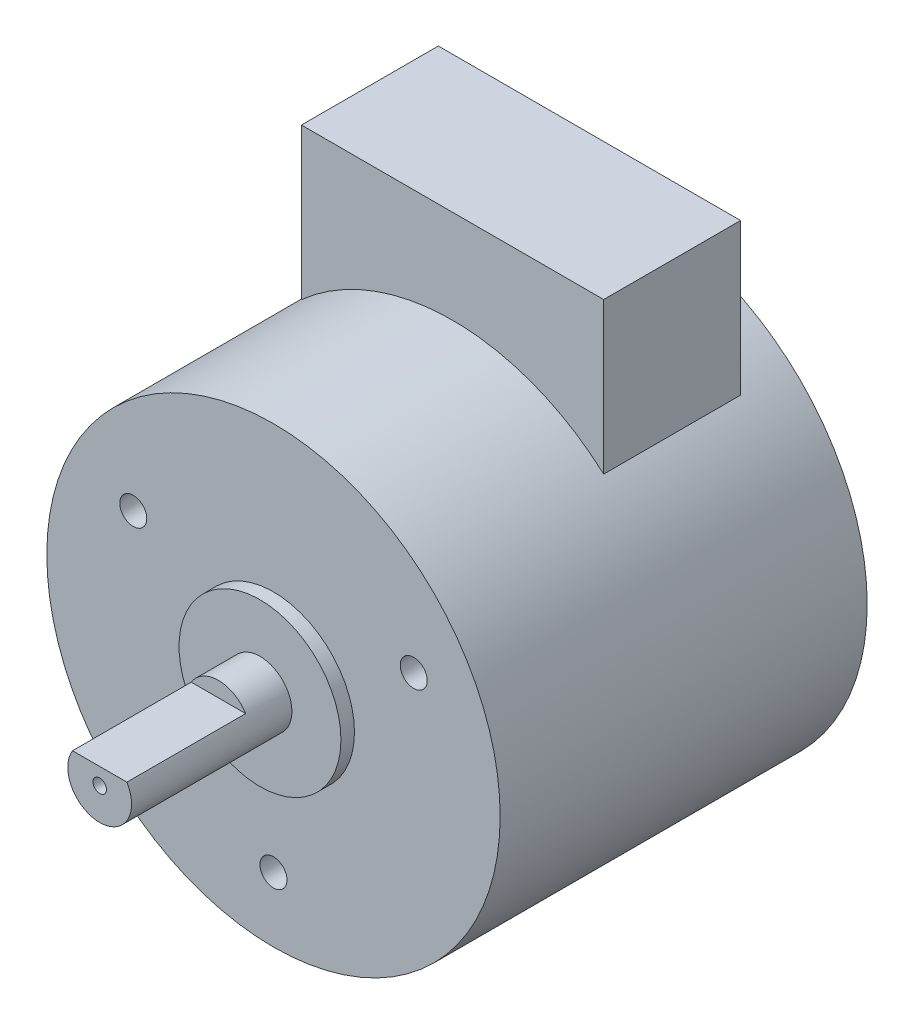
ISO-10303-21;
HEADER;
FILE_DESCRIPTION(('STEP AP214'),'2;1');
FILE_NAME('part.step','',(''),(''),'','','');
FILE_SCHEMA(('AUTOMOTIVE_DESIGN { 1 0 10303 214 1 1 1 1 }'));
ENDSEC;
DATA;
#1=APPLICATION_CONTEXT('core data for automotive mechanical design processes');
#2=APPLICATION_PROTOCOL_DEFINITION('international standard','automotive_design',2000,#1);
#3=PRODUCT_CONTEXT('',#1,'mechanical');
#4=PRODUCT('Part','Part','',(#3));
#5=PRODUCT_RELATED_PRODUCT_CATEGORY('part','',(#4));
#6=PRODUCT_DEFINITION_FORMATION('','',#4);
#7=PRODUCT_DEFINITION_CONTEXT('part definition',#1,'design');
#8=PRODUCT_DEFINITION('design','',#6,#7);
#9=PRODUCT_DEFINITION_SHAPE('','',#8);
#10=(LENGTH_UNIT() NAMED_UNIT(*) SI_UNIT(.MILLI.,.METRE.));
#11=(NAMED_UNIT(*) PLANE_ANGLE_UNIT() SI_UNIT($,.RADIAN.));
#12=(NAMED_UNIT(*) SI_UNIT($,.STERADIAN.) SOLID_ANGLE_UNIT());
#13=UNCERTAINTY_MEASURE_WITH_UNIT(LENGTH_MEASURE(1.E-05),#10,'distance_accuracy_value','');
#14=(GEOMETRIC_REPRESENTATION_CONTEXT(3) GLOBAL_UNCERTAINTY_ASSIGNED_CONTEXT((#13)) GLOBAL_UNIT_ASSIGNED_CONTEXT((#10,
#11,#12)) REPRESENTATION_CONTEXT('',''));
#15=CARTESIAN_POINT('',(0.,0.,0.));
#16=DIRECTION('',(0.,0.,1.));
#17=DIRECTION('',(1.,0.,0.));
#18=AXIS2_PLACEMENT_3D('',#15,#16,#17);
#19=CARTESIAN_POINT('',(0.,0.,34.));
#20=DIRECTION('',(0.,0.,-1.));
#21=DIRECTION('',(-1.,0.,0.));
#22=AXIS2_PLACEMENT_3D('',#19,#20,#21);
#23=CYLINDRICAL_SURFACE('',#22,21.);
#24=DIRECTION('',(0.,0.,1.));
#25=VECTOR('',#24,1.);
#26=CARTESIAN_POINT('',(-14.,15.6524758424985,4.73));
#27=LINE('',#26,#25);
#28=CARTESIAN_POINT('',(-14.,15.6524758424985,4.73));
#29=VERTEX_POINT('',#28);
#30=CARTESIAN_POINT('',(-14.,15.6524758424985,17.41));
#31=VERTEX_POINT('',#30);
#32=EDGE_CURVE('E55',#29,#31,#27,.T.);
#33=ORIENTED_EDGE('',*,*,#32,.F.);
#34=CARTESIAN_POINT('',(0.,0.,4.73));
#35=DIRECTION('',(0.,0.,-1.));
#36=DIRECTION('',(-1.,0.,0.));
#37=AXIS2_PLACEMENT_3D('',#34,#35,#36);
#38=CIRCLE('',#37,21.);
#39=CARTESIAN_POINT('',(14.,15.6524758424985,4.73));
#40=VERTEX_POINT('',#39);
#41=EDGE_CURVE('E59',#29,#40,#38,.T.);
#42=ORIENTED_EDGE('',*,*,#41,.T.);
#43=DIRECTION('',(0.,0.,1.));
#44=VECTOR('',#43,1.);
#45=CARTESIAN_POINT('',(14.,15.6524758424985,4.73));
#46=LINE('',#45,#44);
#47=CARTESIAN_POINT('',(14.,15.6524758424985,17.41));
#48=VERTEX_POINT('',#47);
#49=EDGE_CURVE('E103',#40,#48,#46,.T.);
#50=ORIENTED_EDGE('',*,*,#49,.T.);
#51=CARTESIAN_POINT('',(0.,0.,17.41));
#52=DIRECTION('',(0.,0.,-1.));
#53=DIRECTION('',(-1.,0.,0.));
#54=AXIS2_PLACEMENT_3D('',#51,#52,#53);
#55=CIRCLE('',#54,21.);
#56=EDGE_CURVE('E119',#31,#48,#55,.T.);
#57=ORIENTED_EDGE('',*,*,#56,.F.);
#58=EDGE_LOOP('',(#33,#42,#50,#57));
#59=FACE_BOUND('',#58,.T.);
#60=CARTESIAN_POINT('',(0.,0.,34.));
#61=DIRECTION('',(0.,0.,1.));
#62=DIRECTION('',(1.,0.,0.));
#63=AXIS2_PLACEMENT_3D('',#60,#61,#62);
#64=CIRCLE('',#63,21.);
#65=CARTESIAN_POINT('',(21.,0.,34.));
#66=VERTEX_POINT('',#65);
#67=EDGE_CURVE('E174',#66,#66,#64,.T.);
#68=ORIENTED_EDGE('',*,*,#67,.F.);
#69=EDGE_LOOP('',(#68));
#70=FACE_BOUND('',#69,.T.);
#71=CARTESIAN_POINT('',(0.,0.,0.));
#72=DIRECTION('',(0.,0.,1.));
#73=DIRECTION('',(1.,0.,0.));
#74=AXIS2_PLACEMENT_3D('',#71,#72,#73);
#75=CIRCLE('',#74,21.);
#76=CARTESIAN_POINT('',(21.,0.,0.));
#77=VERTEX_POINT('',#76);
#78=EDGE_CURVE('E42',#77,#77,#75,.T.);
#79=ORIENTED_EDGE('',*,*,#78,.T.);
#80=EDGE_LOOP('',(#79));
#81=FACE_BOUND('',#80,.T.);
#82=ADVANCED_FACE('F39',(#59,#70,#81),#23,.T.);
#83=CARTESIAN_POINT('',(0.,0.,34.));
#84=DIRECTION('',(0.,0.,1.));
#85=DIRECTION('',(1.,0.,0.));
#86=AXIS2_PLACEMENT_3D('',#83,#84,#85);
#87=PLANE('',#86);
#88=CARTESIAN_POINT('',(-12.9903810567665,7.50000000000006,34.));
#89=DIRECTION('',(0.,0.,1.));
#90=DIRECTION('',(-0.500000000000004,-0.866025403784436,0.));
#91=AXIS2_PLACEMENT_3D('',#88,#89,#90);
#92=CIRCLE('',#91,1.25);
#93=CARTESIAN_POINT('',(-13.6153810567666,6.41746824526952,34.));
#94=VERTEX_POINT('',#93);
#95=EDGE_CURVE('E136',#94,#94,#92,.T.);
#96=ORIENTED_EDGE('',*,*,#95,.F.);
#97=EDGE_LOOP('',(#96));
#98=FACE_BOUND('',#97,.T.);
#99=CARTESIAN_POINT('',(12.9903810567666,7.49999999999988,34.));
#100=DIRECTION('',(0.,0.,1.));
#101=DIRECTION('',(-0.499999999999992,0.866025403784443,0.));
#102=AXIS2_PLACEMENT_3D('',#99,#100,#101);
#103=CIRCLE('',#102,1.25);
#104=CARTESIAN_POINT('',(12.3653810567667,8.58253175473043,34.));
#105=VERTEX_POINT('',#104);
#106=EDGE_CURVE('E129',#105,#105,#103,.T.);
#107=ORIENTED_EDGE('',*,*,#106,.F.);
#108=EDGE_LOOP('',(#107));
#109=FACE_BOUND('',#108,.T.);
#110=CARTESIAN_POINT('',(0.,-15.,34.));
#111=DIRECTION('',(0.,0.,1.));
#112=DIRECTION('',(1.,0.,0.));
#113=AXIS2_PLACEMENT_3D('',#110,#111,#112);
#114=CIRCLE('',#113,1.25);
#115=CARTESIAN_POINT('',(1.25,-15.,34.));
#116=VERTEX_POINT('',#115);
#117=EDGE_CURVE('E135',#116,#116,#114,.T.);
#118=ORIENTED_EDGE('',*,*,#117,.F.);
#119=EDGE_LOOP('',(#118));
#120=FACE_BOUND('',#119,.T.);
#121=CARTESIAN_POINT('',(0.,0.,34.));
#122=DIRECTION('',(0.,0.,1.));
#123=DIRECTION('',(1.,0.,0.));
#124=AXIS2_PLACEMENT_3D('',#121,#122,#123);
#125=CIRCLE('',#124,7.5);
#126=CARTESIAN_POINT('',(7.5,0.,34.));
#127=VERTEX_POINT('',#126);
#128=EDGE_CURVE('E47',#127,#127,#125,.T.);
#129=ORIENTED_EDGE('',*,*,#128,.F.);
#130=EDGE_LOOP('',(#129));
#131=FACE_BOUND('',#130,.T.);
#132=ORIENTED_EDGE('',*,*,#67,.T.);
#133=EDGE_LOOP('',(#132));
#134=FACE_BOUND('',#133,.T.);
#135=ADVANCED_FACE('F185',(#98,#109,#120,#131,#134),#87,.T.);
#136=CARTESIAN_POINT('',(0.,0.,0.));
#137=DIRECTION('',(0.,0.,1.));
#138=DIRECTION('',(1.,0.,0.));
#139=AXIS2_PLACEMENT_3D('',#136,#137,#138);
#140=PLANE('',#139);
#141=CARTESIAN_POINT('',(0.,0.,0.));
#142=DIRECTION('',(0.,0.,-1.));
#143=DIRECTION('',(-1.,0.,0.));
#144=AXIS2_PLACEMENT_3D('',#141,#142,#143);
#145=CIRCLE('',#144,4.);
#146=CARTESIAN_POINT('',(-4.,0.,0.));
#147=VERTEX_POINT('',#146);
#148=EDGE_CURVE('E484',#147,#147,#145,.T.);
#149=ORIENTED_EDGE('',*,*,#148,.F.);
#150=EDGE_LOOP('',(#149));
#151=FACE_BOUND('',#150,.T.);
#152=ORIENTED_EDGE('',*,*,#78,.F.);
#153=EDGE_LOOP('',(#152));
#154=FACE_BOUND('',#153,.T.);
#155=ADVANCED_FACE('F182',(#151,#154),#140,.F.);
#156=CARTESIAN_POINT('',(0.,0.,35.25));
#157=DIRECTION('',(0.,0.,-1.));
#158=DIRECTION('',(-1.,0.,0.));
#159=AXIS2_PLACEMENT_3D('',#156,#157,#158);
#160=CYLINDRICAL_SURFACE('',#159,7.5);
#161=CARTESIAN_POINT('',(0.,0.,35.25));
#162=DIRECTION('',(0.,0.,1.));
#163=DIRECTION('',(1.,0.,0.));
#164=AXIS2_PLACEMENT_3D('',#161,#162,#163);
#165=CIRCLE('',#164,7.5);
#166=CARTESIAN_POINT('',(7.5,0.,35.25));
#167=VERTEX_POINT('',#166);
#168=EDGE_CURVE('E169',#167,#167,#165,.T.);
#169=ORIENTED_EDGE('',*,*,#168,.F.);
#170=EDGE_LOOP('',(#169));
#171=FACE_BOUND('',#170,.T.);
#172=ORIENTED_EDGE('',*,*,#128,.T.);
#173=EDGE_LOOP('',(#172));
#174=FACE_BOUND('',#173,.T.);
#175=ADVANCED_FACE('F184',(#171,#174),#160,.T.);
#176=CARTESIAN_POINT('',(0.,0.,35.25));
#177=DIRECTION('',(0.,0.,1.));
#178=DIRECTION('',(1.,0.,0.));
#179=AXIS2_PLACEMENT_3D('',#176,#177,#178);
#180=PLANE('',#179);
#181=CARTESIAN_POINT('',(0.,0.,35.25));
#182=DIRECTION('',(0.,0.,1.));
#183=DIRECTION('',(1.,0.,0.));
#184=AXIS2_PLACEMENT_3D('',#181,#182,#183);
#185=CIRCLE('',#184,2.955);
#186=CARTESIAN_POINT('',(2.955,0.,35.25));
#187=VERTEX_POINT('',#186);
#188=EDGE_CURVE('E11',#187,#187,#185,.T.);
#189=ORIENTED_EDGE('',*,*,#188,.F.);
#190=EDGE_LOOP('',(#189));
#191=FACE_BOUND('',#190,.T.);
#192=ORIENTED_EDGE('',*,*,#168,.T.);
#193=EDGE_LOOP('',(#192));
#194=FACE_BOUND('',#193,.T.);
#195=ADVANCED_FACE('F191',(#191,#194),#180,.T.);
#196=CARTESIAN_POINT('',(0.,0.,50.1));
#197=DIRECTION('',(0.,0.,-1.));
#198=DIRECTION('',(-1.,0.,0.));
#199=AXIS2_PLACEMENT_3D('',#196,#197,#198);
#200=CYLINDRICAL_SURFACE('',#199,2.955);
#201=CARTESIAN_POINT('',(0.,0.,50.1));
#202=DIRECTION('',(0.,0.,1.));
#203=DIRECTION('',(1.,0.,0.));
#204=AXIS2_PLACEMENT_3D('',#201,#202,#203);
#205=CIRCLE('',#204,2.955);
#206=CARTESIAN_POINT('',(-2.518928343562,1.545,50.1));
#207=VERTEX_POINT('',#206);
#208=CARTESIAN_POINT('',(2.518928343562,1.545,50.1));
#209=VERTEX_POINT('',#208);
#210=EDGE_CURVE('E166',#207,#209,#205,.T.);
#211=ORIENTED_EDGE('',*,*,#210,.F.);
#212=DIRECTION('',(0.,0.,1.));
#213=VECTOR('',#212,1.);
#214=CARTESIAN_POINT('',(-2.518928343562,1.545,39.1));
#215=LINE('',#214,#213);
#216=CARTESIAN_POINT('',(-2.518928343562,1.545,39.1));
#217=VERTEX_POINT('',#216);
#218=EDGE_CURVE('E161',#217,#207,#215,.T.);
#219=ORIENTED_EDGE('',*,*,#218,.F.);
#220=CARTESIAN_POINT('',(0.,0.,39.1));
#221=DIRECTION('',(0.,0.,1.));
#222=DIRECTION('',(-1.,0.,0.));
#223=AXIS2_PLACEMENT_3D('',#220,#221,#222);
#224=CIRCLE('',#223,2.955);
#225=CARTESIAN_POINT('',(2.518928343562,1.545,39.1));
#226=VERTEX_POINT('',#225);
#227=EDGE_CURVE('E156',#226,#217,#224,.T.);
#228=ORIENTED_EDGE('',*,*,#227,.F.);
#229=DIRECTION('',(0.,0.,1.));
#230=VECTOR('',#229,1.);
#231=CARTESIAN_POINT('',(2.518928343562,1.545,39.1));
#232=LINE('',#231,#230);
#233=EDGE_CURVE('E163',#226,#209,#232,.T.);
#234=ORIENTED_EDGE('',*,*,#233,.T.);
#235=EDGE_LOOP('',(#211,#219,#228,#234));
#236=FACE_BOUND('',#235,.T.);
#237=ORIENTED_EDGE('',*,*,#188,.T.);
#238=EDGE_LOOP('',(#237));
#239=FACE_BOUND('',#238,.T.);
#240=ADVANCED_FACE('F404',(#236,#239),#200,.T.);
#241=CARTESIAN_POINT('',(0.,0.,50.1));
#242=DIRECTION('',(0.,0.,1.));
#243=DIRECTION('',(1.,0.,0.));
#244=AXIS2_PLACEMENT_3D('',#241,#242,#243);
#245=PLANE('',#244);
#246=CARTESIAN_POINT('',(0.,0.,50.1));
#247=DIRECTION('',(0.,0.,1.));
#248=DIRECTION('',(1.,0.,0.));
#249=AXIS2_PLACEMENT_3D('',#246,#247,#248);
#250=CIRCLE('',#249,0.625);
#251=CARTESIAN_POINT('',(0.625,0.,50.1));
#252=VERTEX_POINT('',#251);
#253=EDGE_CURVE('E147',#252,#252,#250,.T.);
#254=ORIENTED_EDGE('',*,*,#253,.F.);
#255=EDGE_LOOP('',(#254));
#256=FACE_BOUND('',#255,.T.);
#257=DIRECTION('',(1.,0.,0.));
#258=VECTOR('',#257,1.);
#259=CARTESIAN_POINT('',(-2.518928343562,1.545,50.1));
#260=LINE('',#259,#258);
#261=EDGE_CURVE('E153',#207,#209,#260,.T.);
#262=ORIENTED_EDGE('',*,*,#261,.F.);
#263=ORIENTED_EDGE('',*,*,#210,.T.);
#264=EDGE_LOOP('',(#262,#263));
#265=FACE_BOUND('',#264,.T.);
#266=ADVANCED_FACE('F394',(#256,#265),#245,.T.);
#267=CARTESIAN_POINT('',(-2.518928343562,1.545,39.1));
#268=DIRECTION('',(0.,-1.,0.));
#269=DIRECTION('',(0.,0.,-1.));
#270=AXIS2_PLACEMENT_3D('',#267,#268,#269);
#271=PLANE('',#270);
#272=ORIENTED_EDGE('',*,*,#261,.T.);
#273=ORIENTED_EDGE('',*,*,#233,.F.);
#274=DIRECTION('',(1.,0.,0.));
#275=VECTOR('',#274,1.);
#276=CARTESIAN_POINT('',(-2.518928343562,1.545,39.1));
#277=LINE('',#276,#275);
#278=EDGE_CURVE('E158',#217,#226,#277,.T.);
#279=ORIENTED_EDGE('',*,*,#278,.F.);
#280=ORIENTED_EDGE('',*,*,#218,.T.);
#281=EDGE_LOOP('',(#272,#273,#279,#280));
#282=FACE_BOUND('',#281,.T.);
#283=ADVANCED_FACE('F384',(#282),#271,.F.);
#284=CARTESIAN_POINT('',(0.,0.,39.1));
#285=DIRECTION('',(0.,0.,-1.));
#286=DIRECTION('',(-1.,0.,0.));
#287=AXIS2_PLACEMENT_3D('',#284,#285,#286);
#288=PLANE('',#287);
#289=ORIENTED_EDGE('',*,*,#227,.T.);
#290=ORIENTED_EDGE('',*,*,#278,.T.);
#291=EDGE_LOOP('',(#289,#290));
#292=FACE_BOUND('',#291,.T.);
#293=ADVANCED_FACE('F374',(#292),#288,.F.);
#294=CARTESIAN_POINT('',(0.,0.,30.1));
#295=DIRECTION('',(0.,0.,1.));
#296=DIRECTION('',(1.,0.,0.));
#297=AXIS2_PLACEMENT_3D('',#294,#295,#296);
#298=CYLINDRICAL_SURFACE('',#297,0.625);
#299=CARTESIAN_POINT('',(0.,0.,30.1));
#300=DIRECTION('',(0.,0.,1.));
#301=DIRECTION('',(1.,0.,0.));
#302=AXIS2_PLACEMENT_3D('',#299,#300,#301);
#303=CIRCLE('',#302,0.625);
#304=CARTESIAN_POINT('',(0.625,0.,30.1));
#305=VERTEX_POINT('',#304);
#306=EDGE_CURVE('E150',#305,#305,#303,.T.);
#307=ORIENTED_EDGE('',*,*,#306,.F.);
#308=EDGE_LOOP('',(#307));
#309=FACE_BOUND('',#308,.T.);
#310=ORIENTED_EDGE('',*,*,#253,.T.);
#311=EDGE_LOOP('',(#310));
#312=FACE_BOUND('',#311,.T.);
#313=ADVANCED_FACE('F364',(#309,#312),#298,.F.);
#314=CARTESIAN_POINT('',(0.,0.,30.1));
#315=DIRECTION('',(0.,0.,1.));
#316=DIRECTION('',(1.,0.,0.));
#317=AXIS2_PLACEMENT_3D('',#314,#315,#316);
#318=PLANE('',#317);
#319=ORIENTED_EDGE('',*,*,#306,.T.);
#320=EDGE_LOOP('',(#319));
#321=FACE_BOUND('',#320,.T.);
#322=ADVANCED_FACE('F355',(#321),#318,.T.);
#323=CARTESIAN_POINT('',(0.,-15.,30.));
#324=DIRECTION('',(0.,0.,1.));
#325=DIRECTION('',(1.,0.,0.));
#326=AXIS2_PLACEMENT_3D('',#323,#324,#325);
#327=CYLINDRICAL_SURFACE('',#326,1.25);
#328=CARTESIAN_POINT('',(0.,-15.,30.));
#329=DIRECTION('',(0.,0.,1.));
#330=DIRECTION('',(1.,0.,0.));
#331=AXIS2_PLACEMENT_3D('',#328,#329,#330);
#332=CIRCLE('',#331,1.25);
#333=CARTESIAN_POINT('',(1.25,-15.,30.));
#334=VERTEX_POINT('',#333);
#335=EDGE_CURVE('E144',#334,#334,#332,.T.);
#336=ORIENTED_EDGE('',*,*,#335,.F.);
#337=EDGE_LOOP('',(#336));
#338=FACE_BOUND('',#337,.T.);
#339=ORIENTED_EDGE('',*,*,#117,.T.);
#340=EDGE_LOOP('',(#339));
#341=FACE_BOUND('',#340,.T.);
#342=ADVANCED_FACE('F346',(#338,#341),#327,.F.);
#343=CARTESIAN_POINT('',(0.,-15.,30.));
#344=DIRECTION('',(0.,0.,1.));
#345=DIRECTION('',(1.,0.,0.));
#346=AXIS2_PLACEMENT_3D('',#343,#344,#345);
#347=PLANE('',#346);
#348=ORIENTED_EDGE('',*,*,#335,.T.);
#349=EDGE_LOOP('',(#348));
#350=FACE_BOUND('',#349,.T.);
#351=ADVANCED_FACE('F215',(#350),#347,.T.);
#352=CARTESIAN_POINT('',(12.9903810567666,7.49999999999988,30.));
#353=DIRECTION('',(0.,0.,1.));
#354=DIRECTION('',(1.,0.,0.));
#355=AXIS2_PLACEMENT_3D('',#352,#353,#354);
#356=CYLINDRICAL_SURFACE('',#355,1.25);
#357=CARTESIAN_POINT('',(12.9903810567666,7.49999999999988,30.));
#358=DIRECTION('',(0.,0.,1.));
#359=DIRECTION('',(-0.499999999999992,0.866025403784443,0.));
#360=AXIS2_PLACEMENT_3D('',#357,#358,#359);
#361=CIRCLE('',#360,1.25);
#362=CARTESIAN_POINT('',(12.3653810567667,8.58253175473043,30.));
#363=VERTEX_POINT('',#362);
#364=EDGE_CURVE('E139',#363,#363,#361,.T.);
#365=ORIENTED_EDGE('',*,*,#364,.F.);
#366=EDGE_LOOP('',(#365));
#367=FACE_BOUND('',#366,.T.);
#368=ORIENTED_EDGE('',*,*,#106,.T.);
#369=EDGE_LOOP('',(#368));
#370=FACE_BOUND('',#369,.T.);
#371=ADVANCED_FACE('F220',(#367,#370),#356,.F.);
#372=CARTESIAN_POINT('',(12.9903810567666,7.49999999999988,30.));
#373=DIRECTION('',(0.,0.,1.));
#374=DIRECTION('',(-0.499999999999992,0.866025403784443,0.));
#375=AXIS2_PLACEMENT_3D('',#372,#373,#374);
#376=PLANE('',#375);
#377=ORIENTED_EDGE('',*,*,#364,.T.);
#378=EDGE_LOOP('',(#377));
#379=FACE_BOUND('',#378,.T.);
#380=ADVANCED_FACE('F225',(#379),#376,.T.);
#381=CARTESIAN_POINT('',(-12.9903810567665,7.50000000000006,30.));
#382=DIRECTION('',(0.,0.,1.));
#383=DIRECTION('',(1.,0.,0.));
#384=AXIS2_PLACEMENT_3D('',#381,#382,#383);
#385=CYLINDRICAL_SURFACE('',#384,1.25);
#386=CARTESIAN_POINT('',(-12.9903810567665,7.50000000000006,30.));
#387=DIRECTION('',(0.,0.,1.));
#388=DIRECTION('',(-0.500000000000004,-0.866025403784436,0.));
#389=AXIS2_PLACEMENT_3D('',#386,#387,#388);
#390=CIRCLE('',#389,1.25);
#391=CARTESIAN_POINT('',(-13.6153810567666,6.41746824526952,30.));
#392=VERTEX_POINT('',#391);
#393=EDGE_CURVE('E132',#392,#392,#390,.T.);
#394=ORIENTED_EDGE('',*,*,#393,.F.);
#395=EDGE_LOOP('',(#394));
#396=FACE_BOUND('',#395,.T.);
#397=ORIENTED_EDGE('',*,*,#95,.T.);
#398=EDGE_LOOP('',(#397));
#399=FACE_BOUND('',#398,.T.);
#400=ADVANCED_FACE('F236',(#396,#399),#385,.F.);
#401=CARTESIAN_POINT('',(-12.9903810567665,7.50000000000006,30.));
#402=DIRECTION('',(0.,0.,1.));
#403=DIRECTION('',(-0.500000000000004,-0.866025403784436,0.));
#404=AXIS2_PLACEMENT_3D('',#401,#402,#403);
#405=PLANE('',#404);
#406=ORIENTED_EDGE('',*,*,#393,.T.);
#407=EDGE_LOOP('',(#406));
#408=FACE_BOUND('',#407,.T.);
#409=ADVANCED_FACE('F246',(#408),#405,.T.);
#410=CARTESIAN_POINT('',(-14.,15.6524758424985,4.73));
#411=DIRECTION('',(-1.,0.,0.));
#412=DIRECTION('',(0.,-1.,0.));
#413=AXIS2_PLACEMENT_3D('',#410,#411,#412);
#414=PLANE('',#413);
#415=DIRECTION('',(0.,-1.,0.));
#416=VECTOR('',#415,1.);
#417=CARTESIAN_POINT('',(-14.,15.6524758424985,17.41));
#418=LINE('',#417,#416);
#419=CARTESIAN_POINT('',(-14.,29.66,17.41));
#420=VERTEX_POINT('',#419);
#421=EDGE_CURVE('E114',#420,#31,#418,.T.);
#422=ORIENTED_EDGE('',*,*,#421,.F.);
#423=DIRECTION('',(0.,0.,1.));
#424=VECTOR('',#423,1.);
#425=CARTESIAN_POINT('',(-14.,29.66,4.73));
#426=LINE('',#425,#424);
#427=CARTESIAN_POINT('',(-14.,29.66,4.73));
#428=VERTEX_POINT('',#427);
#429=EDGE_CURVE('E102',#428,#420,#426,.T.);
#430=ORIENTED_EDGE('',*,*,#429,.F.);
#431=DIRECTION('',(0.,-1.,0.));
#432=VECTOR('',#431,1.);
#433=CARTESIAN_POINT('',(-14.,15.6524758424985,4.73));
#434=LINE('',#433,#432);
#435=EDGE_CURVE('E110',#428,#29,#434,.T.);
#436=ORIENTED_EDGE('',*,*,#435,.T.);
#437=ORIENTED_EDGE('',*,*,#32,.T.);
#438=EDGE_LOOP('',(#422,#430,#436,#437));
#439=FACE_BOUND('',#438,.T.);
#440=ADVANCED_FACE('F256',(#439),#414,.T.);
#441=CARTESIAN_POINT('',(-14.,29.66,4.73));
#442=DIRECTION('',(0.,1.,0.));
#443=DIRECTION('',(0.,0.,1.));
#444=AXIS2_PLACEMENT_3D('',#441,#442,#443);
#445=PLANE('',#444);
#446=DIRECTION('',(-1.,0.,0.));
#447=VECTOR('',#446,1.);
#448=CARTESIAN_POINT('',(-14.,29.66,17.41));
#449=LINE('',#448,#447);
#450=CARTESIAN_POINT('',(14.,29.66,17.41));
#451=VERTEX_POINT('',#450);
#452=EDGE_CURVE('E97',#451,#420,#449,.T.);
#453=ORIENTED_EDGE('',*,*,#452,.F.);
#454=DIRECTION('',(0.,0.,1.));
#455=VECTOR('',#454,1.);
#456=CARTESIAN_POINT('',(14.,29.66,4.73));
#457=LINE('',#456,#455);
#458=CARTESIAN_POINT('',(14.,29.66,4.73));
#459=VERTEX_POINT('',#458);
#460=EDGE_CURVE('E91',#459,#451,#457,.T.);
#461=ORIENTED_EDGE('',*,*,#460,.F.);
#462=DIRECTION('',(-1.,0.,0.));
#463=VECTOR('',#462,1.);
#464=CARTESIAN_POINT('',(-14.,29.66,4.73));
#465=LINE('',#464,#463);
#466=EDGE_CURVE('E94',#459,#428,#465,.T.);
#467=ORIENTED_EDGE('',*,*,#466,.T.);
#468=ORIENTED_EDGE('',*,*,#429,.T.);
#469=EDGE_LOOP('',(#453,#461,#467,#468));
#470=FACE_BOUND('',#469,.T.);
#471=ADVANCED_FACE('F93',(#470),#445,.T.);
#472=CARTESIAN_POINT('',(14.,29.66,4.73));
#473=DIRECTION('',(1.,0.,0.));
#474=DIRECTION('',(0.,1.,0.));
#475=AXIS2_PLACEMENT_3D('',#472,#473,#474);
#476=PLANE('',#475);
#477=DIRECTION('',(0.,1.,0.));
#478=VECTOR('',#477,1.);
#479=CARTESIAN_POINT('',(14.,29.66,17.41));
#480=LINE('',#479,#478);
#481=EDGE_CURVE('E122',#48,#451,#480,.T.);
#482=ORIENTED_EDGE('',*,*,#481,.F.);
#483=ORIENTED_EDGE('',*,*,#49,.F.);
#484=DIRECTION('',(0.,1.,0.));
#485=VECTOR('',#484,1.);
#486=CARTESIAN_POINT('',(14.,29.66,4.73));
#487=LINE('',#486,#485);
#488=EDGE_CURVE('E108',#40,#459,#487,.T.);
#489=ORIENTED_EDGE('',*,*,#488,.T.);
#490=ORIENTED_EDGE('',*,*,#460,.T.);
#491=EDGE_LOOP('',(#482,#483,#489,#490));
#492=FACE_BOUND('',#491,.T.);
#493=ADVANCED_FACE('F112',(#492),#476,.T.);
#494=CARTESIAN_POINT('',(0.,0.,4.73));
#495=DIRECTION('',(0.,0.,-1.));
#496=DIRECTION('',(-1.,0.,0.));
#497=AXIS2_PLACEMENT_3D('',#494,#495,#496);
#498=PLANE('',#497);
#499=ORIENTED_EDGE('',*,*,#41,.F.);
#500=ORIENTED_EDGE('',*,*,#435,.F.);
#501=ORIENTED_EDGE('',*,*,#466,.F.);
#502=ORIENTED_EDGE('',*,*,#488,.F.);
#503=EDGE_LOOP('',(#499,#500,#501,#502));
#504=FACE_BOUND('',#503,.T.);
#505=ADVANCED_FACE('F107',(#504),#498,.T.);
#506=CARTESIAN_POINT('',(0.,0.,17.41));
#507=DIRECTION('',(0.,0.,-1.));
#508=DIRECTION('',(-1.,0.,0.));
#509=AXIS2_PLACEMENT_3D('',#506,#507,#508);
#510=PLANE('',#509);
#511=ORIENTED_EDGE('',*,*,#56,.T.);
#512=ORIENTED_EDGE('',*,*,#481,.T.);
#513=ORIENTED_EDGE('',*,*,#452,.T.);
#514=ORIENTED_EDGE('',*,*,#421,.T.);
#515=EDGE_LOOP('',(#511,#512,#513,#514));
#516=FACE_BOUND('',#515,.T.);
#517=ADVANCED_FACE('F285',(#516),#510,.F.);
#518=CARTESIAN_POINT('',(0.,0.,1.66));
#519=DIRECTION('',(0.,0.,-1.));
#520=DIRECTION('',(-1.,0.,0.));
#521=AXIS2_PLACEMENT_3D('',#518,#519,#520);
#522=CYLINDRICAL_SURFACE('',#521,4.);
#523=CARTESIAN_POINT('',(0.,0.,1.66));
#524=DIRECTION('',(0.,0.,-1.));
#525=DIRECTION('',(-1.,0.,0.));
#526=AXIS2_PLACEMENT_3D('',#523,#524,#525);
#527=CIRCLE('',#526,4.);
#528=CARTESIAN_POINT('',(-4.,0.,1.66));
#529=VERTEX_POINT('',#528);
#530=EDGE_CURVE('E123',#529,#529,#527,.T.);
#531=CARTESIAN_POINT('',(-4.,0.,1.66));
#532=CARTESIAN_POINT('',(-4.,0.,1.64270833333333));
#533=CARTESIAN_POINT('',(-4.,0.,1.62541666666667));
#534=CARTESIAN_POINT('',(-4.,0.,1.59083333333333));
#535=CARTESIAN_POINT('',(-4.,0.,1.57354166666667));
#536=CARTESIAN_POINT('',(-4.,0.,1.53895833333333));
#537=CARTESIAN_POINT('',(-4.,0.,1.52166666666667));
#538=CARTESIAN_POINT('',(-4.,0.,1.48708333333333));
#539=CARTESIAN_POINT('',(-4.,0.,1.46979166666667));
#540=CARTESIAN_POINT('',(-4.,0.,1.43520833333333));
#541=CARTESIAN_POINT('',(-4.,0.,1.41791666666667));
#542=CARTESIAN_POINT('',(-4.,0.,1.38333333333333));
#543=CARTESIAN_POINT('',(-4.,0.,1.36604166666667));
#544=CARTESIAN_POINT('',(-4.,0.,1.33145833333333));
#545=CARTESIAN_POINT('',(-4.,0.,1.31416666666667));
#546=CARTESIAN_POINT('',(-4.,0.,1.27958333333333));
#547=CARTESIAN_POINT('',(-4.,0.,1.26229166666667));
#548=CARTESIAN_POINT('',(-4.,0.,1.22770833333333));
#549=CARTESIAN_POINT('',(-4.,0.,1.21041666666667));
#550=CARTESIAN_POINT('',(-4.,0.,1.17583333333333));
#551=CARTESIAN_POINT('',(-4.,0.,1.15854166666667));
#552=CARTESIAN_POINT('',(-4.,0.,1.12395833333333));
#553=CARTESIAN_POINT('',(-4.,0.,1.10666666666667));
#554=CARTESIAN_POINT('',(-4.,0.,1.07208333333333));
#555=CARTESIAN_POINT('',(-4.,0.,1.05479166666667));
#556=CARTESIAN_POINT('',(-4.,0.,1.02020833333333));
#557=CARTESIAN_POINT('',(-4.,0.,1.00291666666667));
#558=CARTESIAN_POINT('',(-4.,0.,0.968333333333333));
#559=CARTESIAN_POINT('',(-4.,0.,0.951041666666667));
#560=CARTESIAN_POINT('',(-4.,0.,0.916458333333333));
#561=CARTESIAN_POINT('',(-4.,0.,0.899166666666667));
#562=CARTESIAN_POINT('',(-4.,0.,0.864583333333333));
#563=CARTESIAN_POINT('',(-4.,0.,0.847291666666667));
#564=CARTESIAN_POINT('',(-4.,0.,0.812708333333333));
#565=CARTESIAN_POINT('',(-4.,0.,0.795416666666667));
#566=CARTESIAN_POINT('',(-4.,0.,0.760833333333333));
#567=CARTESIAN_POINT('',(-4.,0.,0.743541666666667));
#568=CARTESIAN_POINT('',(-4.,0.,0.708958333333333));
#569=CARTESIAN_POINT('',(-4.,0.,0.691666666666667));
#570=CARTESIAN_POINT('',(-4.,0.,0.657083333333334));
#571=CARTESIAN_POINT('',(-4.,0.,0.639791666666667));
#572=CARTESIAN_POINT('',(-4.,0.,0.605208333333334));
#573=CARTESIAN_POINT('',(-4.,0.,0.587916666666667));
#574=CARTESIAN_POINT('',(-4.,0.,0.553333333333334));
#575=CARTESIAN_POINT('',(-4.,0.,0.536041666666667));
#576=CARTESIAN_POINT('',(-4.,0.,0.501458333333334));
#577=CARTESIAN_POINT('',(-4.,0.,0.484166666666667));
#578=CARTESIAN_POINT('',(-4.,0.,0.449583333333334));
#579=CARTESIAN_POINT('',(-4.,0.,0.432291666666667));
#580=CARTESIAN_POINT('',(-4.,0.,0.397708333333333));
#581=CARTESIAN_POINT('',(-4.,0.,0.380416666666667));
#582=CARTESIAN_POINT('',(-4.,0.,0.345833333333334));
#583=CARTESIAN_POINT('',(-4.,0.,0.328541666666667));
#584=CARTESIAN_POINT('',(-4.,0.,0.293958333333334));
#585=CARTESIAN_POINT('',(-4.,0.,0.276666666666667));
#586=CARTESIAN_POINT('',(-4.,0.,0.242083333333334));
#587=CARTESIAN_POINT('',(-4.,0.,0.224791666666667));
#588=CARTESIAN_POINT('',(-4.,0.,0.190208333333334));
#589=CARTESIAN_POINT('',(-4.,0.,0.172916666666667));
#590=CARTESIAN_POINT('',(-4.,0.,0.138333333333334));
#591=CARTESIAN_POINT('',(-4.,0.,0.121041666666667));
#592=CARTESIAN_POINT('',(-4.,0.,0.0864583333333336));
#593=CARTESIAN_POINT('',(-4.,0.,0.0691666666666669));
#594=CARTESIAN_POINT('',(-4.,0.,0.0345833333333336));
#595=CARTESIAN_POINT('',(-4.,0.,0.0172916666666669));
#596=CARTESIAN_POINT('',(-4.,0.,0.));
#597=B_SPLINE_CURVE_WITH_KNOTS('',3,(#531,#532,#533,#534,#535,#536,#537,#538,#539,#540,#541,
#542,#543,#544,#545,#546,#547,#548,#549,#550,#551,#552,#553,#554,#555,#556,#557,#558,#559,#560,
#561,#562,#563,#564,#565,#566,#567,#568,#569,#570,#571,#572,#573,#574,#575,#576,#577,#578,#579,
#580,#581,#582,#583,#584,#585,#586,#587,#588,#589,#590,#591,#592,#593,#594,#595,#596),
.UNSPECIFIED.,.F.,.F.,(4,2,2,2,2,2,2,2,2,2,2,2,2,2,2,2,2,2,2,2,2,2,2,2,2,2,2,2,2,2,2,2,4),(0.,
0.0518750000000001,0.10375,0.155625,0.2075,0.259375,0.31125,0.363125,0.415,0.466875,0.51875,
0.570625,0.6225,0.674375,0.72625,0.778125,0.83,0.881875,0.93375,0.985625,1.0375,1.089375,
1.14125,1.193125,1.245,1.296875,1.34875,1.400625,1.4525,1.504375,1.55625,1.608125,1.66),.UNSPECIFIED.);
#598=EDGE_CURVE('BSEAM292',#529,#147,#597,.T.);
#599=ORIENTED_EDGE('',*,*,#530,.F.);
#600=ORIENTED_EDGE('',*,*,#148,.T.);
#601=ORIENTED_EDGE('',*,*,#598,.T.);
#602=ORIENTED_EDGE('',*,*,#598,.F.);
#603=EDGE_LOOP('',(#599,#601,#600,#602));
#604=FACE_BOUND('',#603,.T.);
#605=ADVANCED_FACE('F292',(#604),#522,.F.);
#606=CARTESIAN_POINT('',(0.,0.,1.66));
#607=DIRECTION('',(0.,0.,-1.));
#608=DIRECTION('',(-1.,0.,0.));
#609=AXIS2_PLACEMENT_3D('',#606,#607,#608);
#610=PLANE('',#609);
#611=ORIENTED_EDGE('',*,*,#530,.T.);
#612=EDGE_LOOP('',(#611));
#613=FACE_BOUND('',#612,.T.);
#614=ADVANCED_FACE('F300',(#613),#610,.T.);
#615=CLOSED_SHELL('',(#82,#135,#155,#175,#195,#240,#266,#283,#293,#313,#322,#342,#351,#371,#380,
#400,#409,#440,#471,#493,#505,#517,#605,#614));
#616=MANIFOLD_SOLID_BREP('B2',#615);
#617=ADVANCED_BREP_SHAPE_REPRESENTATION('',(#18,#616),#14);
#618=SHAPE_DEFINITION_REPRESENTATION(#9,#617);
ENDSEC;
END-ISO-10303-21;
